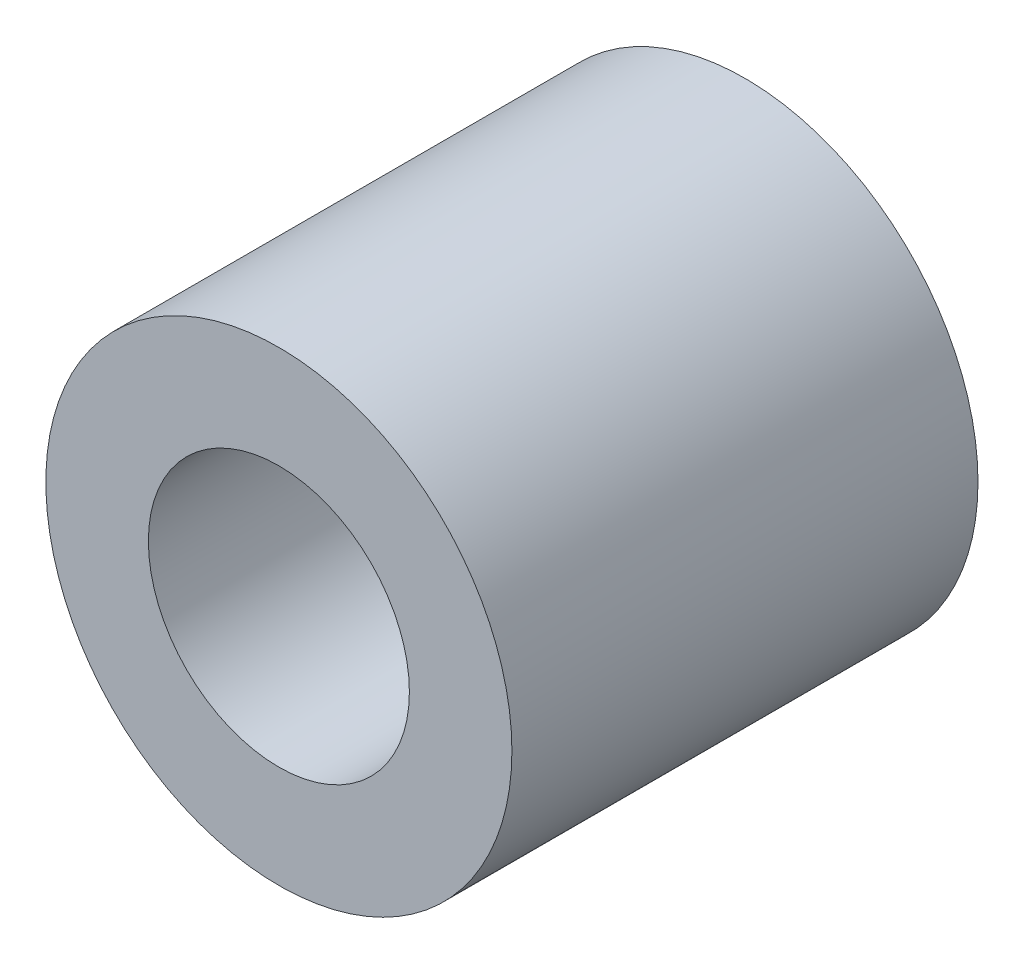
ISO-10303-21;
HEADER;
FILE_DESCRIPTION(('STEP AP214'),'2;1');
FILE_NAME('part.step','',(''),(''),'','','');
FILE_SCHEMA(('AUTOMOTIVE_DESIGN { 1 0 10303 214 1 1 1 1 }'));
ENDSEC;
DATA;
#1=APPLICATION_CONTEXT('core data for automotive mechanical design processes');
#2=APPLICATION_PROTOCOL_DEFINITION('international standard','automotive_design',2000,#1);
#3=PRODUCT_CONTEXT('',#1,'mechanical');
#4=PRODUCT('Part','Part','',(#3));
#5=PRODUCT_RELATED_PRODUCT_CATEGORY('part','',(#4));
#6=PRODUCT_DEFINITION_FORMATION('','',#4);
#7=PRODUCT_DEFINITION_CONTEXT('part definition',#1,'design');
#8=PRODUCT_DEFINITION('design','',#6,#7);
#9=PRODUCT_DEFINITION_SHAPE('','',#8);
#10=(LENGTH_UNIT() NAMED_UNIT(*) SI_UNIT(.MILLI.,.METRE.));
#11=(NAMED_UNIT(*) PLANE_ANGLE_UNIT() SI_UNIT($,.RADIAN.));
#12=(NAMED_UNIT(*) SI_UNIT($,.STERADIAN.) SOLID_ANGLE_UNIT());
#13=UNCERTAINTY_MEASURE_WITH_UNIT(LENGTH_MEASURE(1.E-05),#10,'distance_accuracy_value','');
#14=(GEOMETRIC_REPRESENTATION_CONTEXT(3) GLOBAL_UNCERTAINTY_ASSIGNED_CONTEXT((#13)) GLOBAL_UNIT_ASSIGNED_CONTEXT((#10,
#11,#12)) REPRESENTATION_CONTEXT('',''));
#15=CARTESIAN_POINT('',(0.,0.,0.));
#16=DIRECTION('',(0.,0.,1.));
#17=DIRECTION('',(1.,0.,0.));
#18=AXIS2_PLACEMENT_3D('',#15,#16,#17);
#19=CARTESIAN_POINT('',(0.,0.,6.35));
#20=DIRECTION('',(0.,0.,-1.));
#21=DIRECTION('',(-1.,0.,0.));
#22=AXIS2_PLACEMENT_3D('',#19,#20,#21);
#23=CYLINDRICAL_SURFACE('',#22,3.175);
#24=CARTESIAN_POINT('',(0.,0.,6.35));
#25=DIRECTION('',(0.,0.,1.));
#26=DIRECTION('',(1.,0.,0.));
#27=AXIS2_PLACEMENT_3D('',#24,#25,#26);
#28=CIRCLE('',#27,3.175);
#29=CARTESIAN_POINT('',(3.175,0.,6.35));
#30=VERTEX_POINT('',#29);
#31=EDGE_CURVE('E10',#30,#30,#28,.T.);
#32=ORIENTED_EDGE('',*,*,#31,.F.);
#33=EDGE_LOOP('',(#32));
#34=FACE_BOUND('',#33,.T.);
#35=CARTESIAN_POINT('',(0.,0.,0.));
#36=DIRECTION('',(0.,0.,1.));
#37=DIRECTION('',(1.,0.,0.));
#38=AXIS2_PLACEMENT_3D('',#35,#36,#37);
#39=CIRCLE('',#38,3.175);
#40=CARTESIAN_POINT('',(3.175,0.,0.));
#41=VERTEX_POINT('',#40);
#42=EDGE_CURVE('E42',#41,#41,#39,.T.);
#43=ORIENTED_EDGE('',*,*,#42,.T.);
#44=EDGE_LOOP('',(#43));
#45=FACE_BOUND('',#44,.T.);
#46=ADVANCED_FACE('F39',(#34,#45),#23,.T.);
#47=CARTESIAN_POINT('',(0.,0.,6.35));
#48=DIRECTION('',(0.,0.,1.));
#49=DIRECTION('',(1.,0.,0.));
#50=AXIS2_PLACEMENT_3D('',#47,#48,#49);
#51=PLANE('',#50);
#52=CARTESIAN_POINT('',(0.,0.,6.35));
#53=DIRECTION('',(0.,0.,1.));
#54=DIRECTION('',(1.,0.,0.));
#55=AXIS2_PLACEMENT_3D('',#52,#53,#54);
#56=CIRCLE('',#55,1.778);
#57=CARTESIAN_POINT('',(1.778,0.,6.35));
#58=VERTEX_POINT('',#57);
#59=EDGE_CURVE('E53',#58,#58,#56,.T.);
#60=ORIENTED_EDGE('',*,*,#59,.F.);
#61=EDGE_LOOP('',(#60));
#62=FACE_BOUND('',#61,.T.);
#63=ORIENTED_EDGE('',*,*,#31,.T.);
#64=EDGE_LOOP('',(#63));
#65=FACE_BOUND('',#64,.T.);
#66=ADVANCED_FACE('F70',(#62,#65),#51,.T.);
#67=CARTESIAN_POINT('',(0.,0.,0.));
#68=DIRECTION('',(0.,0.,1.));
#69=DIRECTION('',(1.,0.,0.));
#70=AXIS2_PLACEMENT_3D('',#67,#68,#69);
#71=PLANE('',#70);
#72=CARTESIAN_POINT('',(0.,0.,0.));
#73=DIRECTION('',(0.,0.,1.));
#74=DIRECTION('',(1.,0.,0.));
#75=AXIS2_PLACEMENT_3D('',#72,#73,#74);
#76=CIRCLE('',#75,1.778);
#77=CARTESIAN_POINT('',(1.778,0.,0.));
#78=VERTEX_POINT('',#77);
#79=EDGE_CURVE('E51',#78,#78,#76,.T.);
#80=ORIENTED_EDGE('',*,*,#79,.T.);
#81=EDGE_LOOP('',(#80));
#82=FACE_BOUND('',#81,.T.);
#83=ORIENTED_EDGE('',*,*,#42,.F.);
#84=EDGE_LOOP('',(#83));
#85=FACE_BOUND('',#84,.T.);
#86=ADVANCED_FACE('F61',(#82,#85),#71,.F.);
#87=CARTESIAN_POINT('',(0.,0.,0.));
#88=DIRECTION('',(0.,0.,1.));
#89=DIRECTION('',(1.,0.,0.));
#90=AXIS2_PLACEMENT_3D('',#87,#88,#89);
#91=CYLINDRICAL_SURFACE('',#90,1.778);
#92=ORIENTED_EDGE('',*,*,#79,.F.);
#93=EDGE_LOOP('',(#92));
#94=FACE_BOUND('',#93,.T.);
#95=ORIENTED_EDGE('',*,*,#59,.T.);
#96=EDGE_LOOP('',(#95));
#97=FACE_BOUND('',#96,.T.);
#98=ADVANCED_FACE('F64',(#94,#97),#91,.F.);
#99=CLOSED_SHELL('',(#46,#66,#86,#98));
#100=MANIFOLD_SOLID_BREP('B2',#99);
#101=ADVANCED_BREP_SHAPE_REPRESENTATION('',(#18,#100),#14);
#102=SHAPE_DEFINITION_REPRESENTATION(#9,#101);
ENDSEC;
END-ISO-10303-21;
